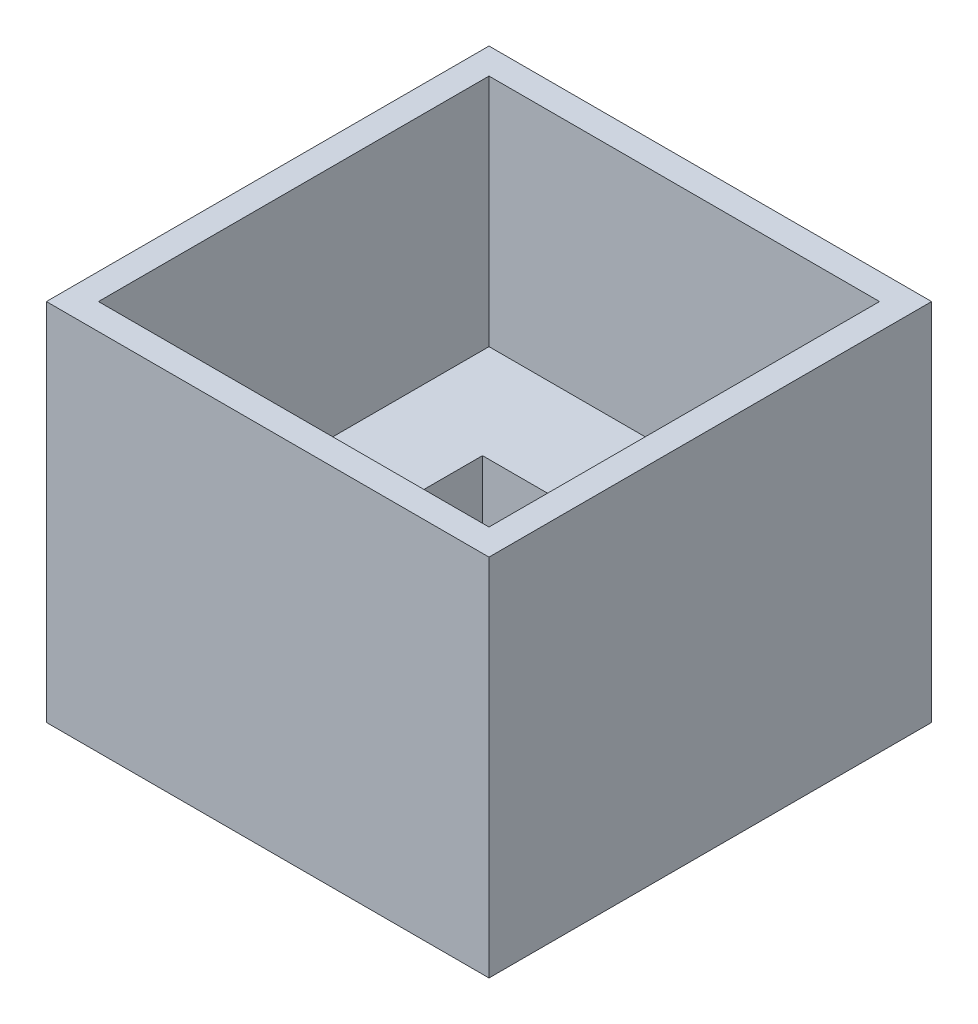
ISO-10303-21;
HEADER;
FILE_DESCRIPTION(('STEP AP214'),'2;1');
FILE_NAME('part.step','',(''),(''),'','','');
FILE_SCHEMA(('AUTOMOTIVE_DESIGN { 1 0 10303 214 1 1 1 1 }'));
ENDSEC;
DATA;
#1=APPLICATION_CONTEXT('core data for automotive mechanical design processes');
#2=APPLICATION_PROTOCOL_DEFINITION('international standard','automotive_design',2000,#1);
#3=PRODUCT_CONTEXT('',#1,'mechanical');
#4=PRODUCT('Part','Part','',(#3));
#5=PRODUCT_RELATED_PRODUCT_CATEGORY('part','',(#4));
#6=PRODUCT_DEFINITION_FORMATION('','',#4);
#7=PRODUCT_DEFINITION_CONTEXT('part definition',#1,'design');
#8=PRODUCT_DEFINITION('design','',#6,#7);
#9=PRODUCT_DEFINITION_SHAPE('','',#8);
#10=(LENGTH_UNIT() NAMED_UNIT(*) SI_UNIT(.MILLI.,.METRE.));
#11=(NAMED_UNIT(*) PLANE_ANGLE_UNIT() SI_UNIT($,.RADIAN.));
#12=(NAMED_UNIT(*) SI_UNIT($,.STERADIAN.) SOLID_ANGLE_UNIT());
#13=UNCERTAINTY_MEASURE_WITH_UNIT(LENGTH_MEASURE(1.E-05),#10,'distance_accuracy_value','');
#14=(GEOMETRIC_REPRESENTATION_CONTEXT(3) GLOBAL_UNCERTAINTY_ASSIGNED_CONTEXT((#13)) GLOBAL_UNIT_ASSIGNED_CONTEXT((#10,
#11,#12)) REPRESENTATION_CONTEXT('',''));
#15=CARTESIAN_POINT('',(0.,0.,0.));
#16=DIRECTION('',(0.,0.,1.));
#17=DIRECTION('',(1.,0.,0.));
#18=AXIS2_PLACEMENT_3D('',#15,#16,#17);
#19=CARTESIAN_POINT('',(0.,50.,0.));
#20=DIRECTION('',(0.,-1.,0.));
#21=DIRECTION('',(0.,0.,-1.));
#22=AXIS2_PLACEMENT_3D('',#19,#20,#21);
#23=PLANE('',#22);
#24=DIRECTION('',(0.,0.,-1.));
#25=VECTOR('',#24,1.);
#26=CARTESIAN_POINT('',(75.,50.,75.));
#27=LINE('',#26,#25);
#28=CARTESIAN_POINT('',(75.,50.,75.));
#29=VERTEX_POINT('',#28);
#30=CARTESIAN_POINT('',(75.,50.,-75.));
#31=VERTEX_POINT('',#30);
#32=EDGE_CURVE('E178',#29,#31,#27,.T.);
#33=ORIENTED_EDGE('',*,*,#32,.T.);
#34=DIRECTION('',(-1.,0.,0.));
#35=VECTOR('',#34,1.);
#36=CARTESIAN_POINT('',(-75.,50.,-75.));
#37=LINE('',#36,#35);
#38=CARTESIAN_POINT('',(-75.,50.,-75.));
#39=VERTEX_POINT('',#38);
#40=EDGE_CURVE('E182',#31,#39,#37,.T.);
#41=ORIENTED_EDGE('',*,*,#40,.T.);
#42=DIRECTION('',(0.,0.,1.));
#43=VECTOR('',#42,1.);
#44=CARTESIAN_POINT('',(-75.,50.,75.));
#45=LINE('',#44,#43);
#46=CARTESIAN_POINT('',(-75.,50.,75.));
#47=VERTEX_POINT('',#46);
#48=EDGE_CURVE('E187',#39,#47,#45,.T.);
#49=ORIENTED_EDGE('',*,*,#48,.T.);
#50=DIRECTION('',(1.,0.,0.));
#51=VECTOR('',#50,1.);
#52=CARTESIAN_POINT('',(-75.,50.,75.));
#53=LINE('',#52,#51);
#54=EDGE_CURVE('E191',#47,#29,#53,.T.);
#55=ORIENTED_EDGE('',*,*,#54,.T.);
#56=EDGE_LOOP('',(#33,#41,#49,#55));
#57=FACE_BOUND('',#56,.T.);
#58=DIRECTION('',(0.,0.,-1.));
#59=VECTOR('',#58,1.);
#60=CARTESIAN_POINT('',(40.,50.,-37.5));
#61=LINE('',#60,#59);
#62=CARTESIAN_POINT('',(40.,50.,37.5));
#63=VERTEX_POINT('',#62);
#64=CARTESIAN_POINT('',(40.,50.,-37.5));
#65=VERTEX_POINT('',#64);
#66=EDGE_CURVE('E145',#63,#65,#61,.T.);
#67=ORIENTED_EDGE('',*,*,#66,.F.);
#68=DIRECTION('',(1.,0.,0.));
#69=VECTOR('',#68,1.);
#70=CARTESIAN_POINT('',(-40.,50.,37.5));
#71=LINE('',#70,#69);
#72=CARTESIAN_POINT('',(-40.,50.,37.5));
#73=VERTEX_POINT('',#72);
#74=EDGE_CURVE('E148',#73,#63,#71,.T.);
#75=ORIENTED_EDGE('',*,*,#74,.F.);
#76=DIRECTION('',(0.,0.,1.));
#77=VECTOR('',#76,1.);
#78=CARTESIAN_POINT('',(-40.,50.,-37.5));
#79=LINE('',#78,#77);
#80=CARTESIAN_POINT('',(-40.,50.,-37.5));
#81=VERTEX_POINT('',#80);
#82=EDGE_CURVE('E55',#81,#73,#79,.T.);
#83=ORIENTED_EDGE('',*,*,#82,.F.);
#84=DIRECTION('',(-1.,0.,0.));
#85=VECTOR('',#84,1.);
#86=CARTESIAN_POINT('',(-40.,50.,-37.5));
#87=LINE('',#86,#85);
#88=EDGE_CURVE('E158',#65,#81,#87,.T.);
#89=ORIENTED_EDGE('',*,*,#88,.F.);
#90=EDGE_LOOP('',(#67,#75,#83,#89));
#91=FACE_BOUND('',#90,.T.);
#92=ADVANCED_FACE('F39',(#57,#91),#23,.F.);
#93=CARTESIAN_POINT('',(85.,140.,85.));
#94=DIRECTION('',(-1.,0.,0.));
#95=DIRECTION('',(0.,0.,1.));
#96=AXIS2_PLACEMENT_3D('',#93,#94,#95);
#97=PLANE('',#96);
#98=DIRECTION('',(0.,0.,-1.));
#99=VECTOR('',#98,1.);
#100=CARTESIAN_POINT('',(85.,0.,85.));
#101=LINE('',#100,#99);
#102=CARTESIAN_POINT('',(85.,0.,85.));
#103=VERTEX_POINT('',#102);
#104=CARTESIAN_POINT('',(85.,0.,-85.));
#105=VERTEX_POINT('',#104);
#106=EDGE_CURVE('E212',#103,#105,#101,.T.);
#107=ORIENTED_EDGE('',*,*,#106,.T.);
#108=DIRECTION('',(0.,-1.,0.));
#109=VECTOR('',#108,1.);
#110=CARTESIAN_POINT('',(85.,140.,-85.));
#111=LINE('',#110,#109);
#112=CARTESIAN_POINT('',(85.,140.,-85.));
#113=VERTEX_POINT('',#112);
#114=EDGE_CURVE('E11',#113,#105,#111,.T.);
#115=ORIENTED_EDGE('',*,*,#114,.F.);
#116=DIRECTION('',(0.,0.,-1.));
#117=VECTOR('',#116,1.);
#118=CARTESIAN_POINT('',(85.,140.,85.));
#119=LINE('',#118,#117);
#120=CARTESIAN_POINT('',(85.,140.,85.));
#121=VERTEX_POINT('',#120);
#122=EDGE_CURVE('E222',#121,#113,#119,.T.);
#123=ORIENTED_EDGE('',*,*,#122,.F.);
#124=DIRECTION('',(0.,-1.,0.));
#125=VECTOR('',#124,1.);
#126=CARTESIAN_POINT('',(85.,140.,85.));
#127=LINE('',#126,#125);
#128=EDGE_CURVE('E236',#121,#103,#127,.T.);
#129=ORIENTED_EDGE('',*,*,#128,.T.);
#130=EDGE_LOOP('',(#107,#115,#123,#129));
#131=FACE_BOUND('',#130,.T.);
#132=ADVANCED_FACE('F41',(#131),#97,.F.);
#133=CARTESIAN_POINT('',(-85.,140.,-85.));
#134=DIRECTION('',(0.,0.,1.));
#135=DIRECTION('',(1.,0.,0.));
#136=AXIS2_PLACEMENT_3D('',#133,#134,#135);
#137=PLANE('',#136);
#138=DIRECTION('',(-1.,0.,0.));
#139=VECTOR('',#138,1.);
#140=CARTESIAN_POINT('',(-85.,0.,-85.));
#141=LINE('',#140,#139);
#142=CARTESIAN_POINT('',(-85.,0.,-85.));
#143=VERTEX_POINT('',#142);
#144=EDGE_CURVE('E240',#105,#143,#141,.T.);
#145=ORIENTED_EDGE('',*,*,#144,.T.);
#146=DIRECTION('',(0.,-1.,0.));
#147=VECTOR('',#146,1.);
#148=CARTESIAN_POINT('',(-85.,140.,-85.));
#149=LINE('',#148,#147);
#150=CARTESIAN_POINT('',(-85.,140.,-85.));
#151=VERTEX_POINT('',#150);
#152=EDGE_CURVE('E48',#151,#143,#149,.T.);
#153=ORIENTED_EDGE('',*,*,#152,.F.);
#154=DIRECTION('',(-1.,0.,0.));
#155=VECTOR('',#154,1.);
#156=CARTESIAN_POINT('',(-85.,140.,-85.));
#157=LINE('',#156,#155);
#158=EDGE_CURVE('E226',#113,#151,#157,.T.);
#159=ORIENTED_EDGE('',*,*,#158,.F.);
#160=ORIENTED_EDGE('',*,*,#114,.T.);
#161=EDGE_LOOP('',(#145,#153,#159,#160));
#162=FACE_BOUND('',#161,.T.);
#163=ADVANCED_FACE('F274',(#162),#137,.F.);
#164=CARTESIAN_POINT('',(-85.,140.,85.));
#165=DIRECTION('',(1.,0.,0.));
#166=DIRECTION('',(0.,0.,-1.));
#167=AXIS2_PLACEMENT_3D('',#164,#165,#166);
#168=PLANE('',#167);
#169=DIRECTION('',(0.,0.,1.));
#170=VECTOR('',#169,1.);
#171=CARTESIAN_POINT('',(-85.,0.,85.));
#172=LINE('',#171,#170);
#173=CARTESIAN_POINT('',(-85.,0.,85.));
#174=VERTEX_POINT('',#173);
#175=EDGE_CURVE('E243',#143,#174,#172,.T.);
#176=ORIENTED_EDGE('',*,*,#175,.T.);
#177=DIRECTION('',(0.,-1.,0.));
#178=VECTOR('',#177,1.);
#179=CARTESIAN_POINT('',(-85.,140.,85.));
#180=LINE('',#179,#178);
#181=CARTESIAN_POINT('',(-85.,140.,85.));
#182=VERTEX_POINT('',#181);
#183=EDGE_CURVE('E251',#182,#174,#180,.T.);
#184=ORIENTED_EDGE('',*,*,#183,.F.);
#185=DIRECTION('',(0.,0.,1.));
#186=VECTOR('',#185,1.);
#187=CARTESIAN_POINT('',(-85.,140.,85.));
#188=LINE('',#187,#186);
#189=EDGE_CURVE('E230',#151,#182,#188,.T.);
#190=ORIENTED_EDGE('',*,*,#189,.F.);
#191=ORIENTED_EDGE('',*,*,#152,.T.);
#192=EDGE_LOOP('',(#176,#184,#190,#191));
#193=FACE_BOUND('',#192,.T.);
#194=ADVANCED_FACE('F260',(#193),#168,.F.);
#195=CARTESIAN_POINT('',(-85.,140.,85.));
#196=DIRECTION('',(0.,0.,-1.));
#197=DIRECTION('',(-1.,0.,0.));
#198=AXIS2_PLACEMENT_3D('',#195,#196,#197);
#199=PLANE('',#198);
#200=DIRECTION('',(1.,0.,0.));
#201=VECTOR('',#200,1.);
#202=CARTESIAN_POINT('',(-85.,0.,85.));
#203=LINE('',#202,#201);
#204=EDGE_CURVE('E227',#174,#103,#203,.T.);
#205=ORIENTED_EDGE('',*,*,#204,.T.);
#206=ORIENTED_EDGE('',*,*,#128,.F.);
#207=DIRECTION('',(1.,0.,0.));
#208=VECTOR('',#207,1.);
#209=CARTESIAN_POINT('',(-85.,140.,85.));
#210=LINE('',#209,#208);
#211=EDGE_CURVE('E233',#182,#121,#210,.T.);
#212=ORIENTED_EDGE('',*,*,#211,.F.);
#213=ORIENTED_EDGE('',*,*,#183,.T.);
#214=EDGE_LOOP('',(#205,#206,#212,#213));
#215=FACE_BOUND('',#214,.T.);
#216=ADVANCED_FACE('F267',(#215),#199,.F.);
#217=CARTESIAN_POINT('',(0.,140.,0.));
#218=DIRECTION('',(0.,-1.,0.));
#219=DIRECTION('',(0.,0.,-1.));
#220=AXIS2_PLACEMENT_3D('',#217,#218,#219);
#221=PLANE('',#220);
#222=DIRECTION('',(-1.,0.,0.));
#223=VECTOR('',#222,1.);
#224=CARTESIAN_POINT('',(-75.,140.,-75.));
#225=LINE('',#224,#223);
#226=CARTESIAN_POINT('',(75.,140.,-75.));
#227=VERTEX_POINT('',#226);
#228=CARTESIAN_POINT('',(-75.,140.,-75.));
#229=VERTEX_POINT('',#228);
#230=EDGE_CURVE('E198',#227,#229,#225,.T.);
#231=ORIENTED_EDGE('',*,*,#230,.F.);
#232=DIRECTION('',(0.,0.,-1.));
#233=VECTOR('',#232,1.);
#234=CARTESIAN_POINT('',(75.,140.,75.));
#235=LINE('',#234,#233);
#236=CARTESIAN_POINT('',(75.,140.,75.));
#237=VERTEX_POINT('',#236);
#238=EDGE_CURVE('E137',#237,#227,#235,.T.);
#239=ORIENTED_EDGE('',*,*,#238,.F.);
#240=DIRECTION('',(1.,0.,0.));
#241=VECTOR('',#240,1.);
#242=CARTESIAN_POINT('',(-75.,140.,75.));
#243=LINE('',#242,#241);
#244=CARTESIAN_POINT('',(-75.,140.,75.));
#245=VERTEX_POINT('',#244);
#246=EDGE_CURVE('E183',#245,#237,#243,.T.);
#247=ORIENTED_EDGE('',*,*,#246,.F.);
#248=DIRECTION('',(0.,0.,1.));
#249=VECTOR('',#248,1.);
#250=CARTESIAN_POINT('',(-75.,140.,75.));
#251=LINE('',#250,#249);
#252=EDGE_CURVE('E202',#229,#245,#251,.T.);
#253=ORIENTED_EDGE('',*,*,#252,.F.);
#254=EDGE_LOOP('',(#231,#239,#247,#253));
#255=FACE_BOUND('',#254,.T.);
#256=ORIENTED_EDGE('',*,*,#122,.T.);
#257=ORIENTED_EDGE('',*,*,#158,.T.);
#258=ORIENTED_EDGE('',*,*,#189,.T.);
#259=ORIENTED_EDGE('',*,*,#211,.T.);
#260=EDGE_LOOP('',(#256,#257,#258,#259));
#261=FACE_BOUND('',#260,.T.);
#262=ADVANCED_FACE('F273',(#255,#261),#221,.F.);
#263=CARTESIAN_POINT('',(0.,0.,0.));
#264=DIRECTION('',(0.,-1.,0.));
#265=DIRECTION('',(0.,0.,-1.));
#266=AXIS2_PLACEMENT_3D('',#263,#264,#265);
#267=PLANE('',#266);
#268=DIRECTION('',(0.,0.,-1.));
#269=VECTOR('',#268,1.);
#270=CARTESIAN_POINT('',(40.,0.,-37.5));
#271=LINE('',#270,#269);
#272=CARTESIAN_POINT('',(40.,0.,37.5));
#273=VERTEX_POINT('',#272);
#274=CARTESIAN_POINT('',(40.,0.,-37.5));
#275=VERTEX_POINT('',#274);
#276=EDGE_CURVE('E142',#273,#275,#271,.T.);
#277=ORIENTED_EDGE('',*,*,#276,.T.);
#278=DIRECTION('',(-1.,0.,0.));
#279=VECTOR('',#278,1.);
#280=CARTESIAN_POINT('',(-40.,0.,-37.5));
#281=LINE('',#280,#279);
#282=CARTESIAN_POINT('',(-40.,0.,-37.5));
#283=VERTEX_POINT('',#282);
#284=EDGE_CURVE('E128',#275,#283,#281,.T.);
#285=ORIENTED_EDGE('',*,*,#284,.T.);
#286=DIRECTION('',(0.,0.,1.));
#287=VECTOR('',#286,1.);
#288=CARTESIAN_POINT('',(-40.,0.,-37.5));
#289=LINE('',#288,#287);
#290=CARTESIAN_POINT('',(-40.,0.,37.5));
#291=VERTEX_POINT('',#290);
#292=EDGE_CURVE('E160',#283,#291,#289,.T.);
#293=ORIENTED_EDGE('',*,*,#292,.T.);
#294=DIRECTION('',(1.,0.,0.));
#295=VECTOR('',#294,1.);
#296=CARTESIAN_POINT('',(-40.,0.,37.5));
#297=LINE('',#296,#295);
#298=EDGE_CURVE('E153',#291,#273,#297,.T.);
#299=ORIENTED_EDGE('',*,*,#298,.T.);
#300=EDGE_LOOP('',(#277,#285,#293,#299));
#301=FACE_BOUND('',#300,.T.);
#302=ORIENTED_EDGE('',*,*,#106,.F.);
#303=ORIENTED_EDGE('',*,*,#204,.F.);
#304=ORIENTED_EDGE('',*,*,#175,.F.);
#305=ORIENTED_EDGE('',*,*,#144,.F.);
#306=EDGE_LOOP('',(#302,#303,#304,#305));
#307=FACE_BOUND('',#306,.T.);
#308=ADVANCED_FACE('F151',(#301,#307),#267,.T.);
#309=CARTESIAN_POINT('',(75.,50.,75.));
#310=DIRECTION('',(1.,0.,0.));
#311=DIRECTION('',(0.,0.,-1.));
#312=AXIS2_PLACEMENT_3D('',#309,#310,#311);
#313=PLANE('',#312);
#314=ORIENTED_EDGE('',*,*,#238,.T.);
#315=DIRECTION('',(0.,1.,0.));
#316=VECTOR('',#315,1.);
#317=CARTESIAN_POINT('',(75.,50.,-75.));
#318=LINE('',#317,#316);
#319=EDGE_CURVE('E195',#31,#227,#318,.T.);
#320=ORIENTED_EDGE('',*,*,#319,.F.);
#321=ORIENTED_EDGE('',*,*,#32,.F.);
#322=DIRECTION('',(0.,1.,0.));
#323=VECTOR('',#322,1.);
#324=CARTESIAN_POINT('',(75.,50.,75.));
#325=LINE('',#324,#323);
#326=EDGE_CURVE('E209',#29,#237,#325,.T.);
#327=ORIENTED_EDGE('',*,*,#326,.T.);
#328=EDGE_LOOP('',(#314,#320,#321,#327));
#329=FACE_BOUND('',#328,.T.);
#330=ADVANCED_FACE('F294',(#329),#313,.F.);
#331=CARTESIAN_POINT('',(-75.,50.,75.));
#332=DIRECTION('',(0.,0.,1.));
#333=DIRECTION('',(1.,0.,0.));
#334=AXIS2_PLACEMENT_3D('',#331,#332,#333);
#335=PLANE('',#334);
#336=ORIENTED_EDGE('',*,*,#246,.T.);
#337=ORIENTED_EDGE('',*,*,#326,.F.);
#338=ORIENTED_EDGE('',*,*,#54,.F.);
#339=DIRECTION('',(0.,1.,0.));
#340=VECTOR('',#339,1.);
#341=CARTESIAN_POINT('',(-75.,50.,75.));
#342=LINE('',#341,#340);
#343=EDGE_CURVE('E213',#47,#245,#342,.T.);
#344=ORIENTED_EDGE('',*,*,#343,.T.);
#345=EDGE_LOOP('',(#336,#337,#338,#344));
#346=FACE_BOUND('',#345,.T.);
#347=ADVANCED_FACE('F290',(#346),#335,.F.);
#348=CARTESIAN_POINT('',(-75.,50.,75.));
#349=DIRECTION('',(-1.,0.,0.));
#350=DIRECTION('',(0.,0.,1.));
#351=AXIS2_PLACEMENT_3D('',#348,#349,#350);
#352=PLANE('',#351);
#353=ORIENTED_EDGE('',*,*,#252,.T.);
#354=ORIENTED_EDGE('',*,*,#343,.F.);
#355=ORIENTED_EDGE('',*,*,#48,.F.);
#356=DIRECTION('',(0.,1.,0.));
#357=VECTOR('',#356,1.);
#358=CARTESIAN_POINT('',(-75.,50.,-75.));
#359=LINE('',#358,#357);
#360=EDGE_CURVE('E216',#39,#229,#359,.T.);
#361=ORIENTED_EDGE('',*,*,#360,.T.);
#362=EDGE_LOOP('',(#353,#354,#355,#361));
#363=FACE_BOUND('',#362,.T.);
#364=ADVANCED_FACE('F293',(#363),#352,.F.);
#365=CARTESIAN_POINT('',(-75.,50.,-75.));
#366=DIRECTION('',(0.,0.,-1.));
#367=DIRECTION('',(-1.,0.,0.));
#368=AXIS2_PLACEMENT_3D('',#365,#366,#367);
#369=PLANE('',#368);
#370=ORIENTED_EDGE('',*,*,#230,.T.);
#371=ORIENTED_EDGE('',*,*,#360,.F.);
#372=ORIENTED_EDGE('',*,*,#40,.F.);
#373=ORIENTED_EDGE('',*,*,#319,.T.);
#374=EDGE_LOOP('',(#370,#371,#372,#373));
#375=FACE_BOUND('',#374,.T.);
#376=ADVANCED_FACE('F298',(#375),#369,.F.);
#377=CARTESIAN_POINT('',(40.,-0.001000000000001,-37.5));
#378=DIRECTION('',(1.,0.,0.));
#379=DIRECTION('',(0.,0.,-1.));
#380=AXIS2_PLACEMENT_3D('',#377,#378,#379);
#381=PLANE('',#380);
#382=DIRECTION('',(0.,1.,0.));
#383=VECTOR('',#382,1.);
#384=CARTESIAN_POINT('',(40.,-0.001000000000001,37.5));
#385=LINE('',#384,#383);
#386=EDGE_CURVE('E138',#273,#63,#385,.T.);
#387=ORIENTED_EDGE('',*,*,#386,.T.);
#388=ORIENTED_EDGE('',*,*,#66,.T.);
#389=DIRECTION('',(0.,1.,0.));
#390=VECTOR('',#389,1.);
#391=CARTESIAN_POINT('',(40.,-0.001000000000001,-37.5));
#392=LINE('',#391,#390);
#393=EDGE_CURVE('E131',#275,#65,#392,.T.);
#394=ORIENTED_EDGE('',*,*,#393,.F.);
#395=ORIENTED_EDGE('',*,*,#276,.F.);
#396=EDGE_LOOP('',(#387,#388,#394,#395));
#397=FACE_BOUND('',#396,.T.);
#398=ADVANCED_FACE('F141',(#397),#381,.F.);
#399=CARTESIAN_POINT('',(-40.,-0.001000000000001,37.5));
#400=DIRECTION('',(0.,0.,1.));
#401=DIRECTION('',(1.,0.,0.));
#402=AXIS2_PLACEMENT_3D('',#399,#400,#401);
#403=PLANE('',#402);
#404=DIRECTION('',(0.,1.,0.));
#405=VECTOR('',#404,1.);
#406=CARTESIAN_POINT('',(-40.,-0.001000000000001,37.5));
#407=LINE('',#406,#405);
#408=EDGE_CURVE('E173',#291,#73,#407,.T.);
#409=ORIENTED_EDGE('',*,*,#408,.T.);
#410=ORIENTED_EDGE('',*,*,#74,.T.);
#411=ORIENTED_EDGE('',*,*,#386,.F.);
#412=ORIENTED_EDGE('',*,*,#298,.F.);
#413=EDGE_LOOP('',(#409,#410,#411,#412));
#414=FACE_BOUND('',#413,.T.);
#415=ADVANCED_FACE('F346',(#414),#403,.F.);
#416=CARTESIAN_POINT('',(-40.,-0.001000000000001,-37.5));
#417=DIRECTION('',(-1.,0.,0.));
#418=DIRECTION('',(0.,0.,1.));
#419=AXIS2_PLACEMENT_3D('',#416,#417,#418);
#420=PLANE('',#419);
#421=DIRECTION('',(0.,1.,0.));
#422=VECTOR('',#421,1.);
#423=CARTESIAN_POINT('',(-40.,-0.001000000000001,-37.5));
#424=LINE('',#423,#422);
#425=EDGE_CURVE('E62',#283,#81,#424,.T.);
#426=ORIENTED_EDGE('',*,*,#425,.T.);
#427=ORIENTED_EDGE('',*,*,#82,.T.);
#428=ORIENTED_EDGE('',*,*,#408,.F.);
#429=ORIENTED_EDGE('',*,*,#292,.F.);
#430=EDGE_LOOP('',(#426,#427,#428,#429));
#431=FACE_BOUND('',#430,.T.);
#432=ADVANCED_FACE('F352',(#431),#420,.F.);
#433=CARTESIAN_POINT('',(-40.,-0.001000000000001,-37.5));
#434=DIRECTION('',(0.,0.,-1.));
#435=DIRECTION('',(-1.,0.,0.));
#436=AXIS2_PLACEMENT_3D('',#433,#434,#435);
#437=PLANE('',#436);
#438=ORIENTED_EDGE('',*,*,#393,.T.);
#439=ORIENTED_EDGE('',*,*,#88,.T.);
#440=ORIENTED_EDGE('',*,*,#425,.F.);
#441=ORIENTED_EDGE('',*,*,#284,.F.);
#442=EDGE_LOOP('',(#438,#439,#440,#441));
#443=FACE_BOUND('',#442,.T.);
#444=ADVANCED_FACE('F130',(#443),#437,.F.);
#445=CLOSED_SHELL('',(#92,#132,#163,#194,#216,#262,#308,#330,#347,#364,#376,#398,#415,#432,#444));
#446=MANIFOLD_SOLID_BREP('B2',#445);
#447=ADVANCED_BREP_SHAPE_REPRESENTATION('',(#18,#446),#14);
#448=SHAPE_DEFINITION_REPRESENTATION(#9,#447);
ENDSEC;
END-ISO-10303-21;
